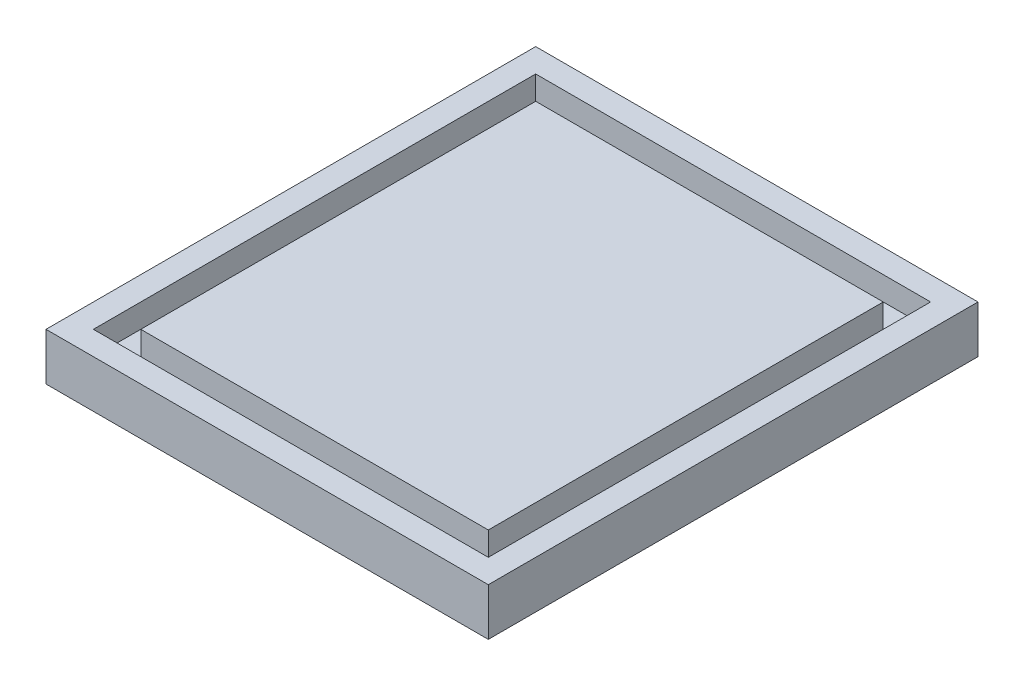
ISO-10303-21;
HEADER;
FILE_DESCRIPTION(('STEP AP214'),'2;1');
FILE_NAME('part.step','',(''),(''),'','','');
FILE_SCHEMA(('AUTOMOTIVE_DESIGN { 1 0 10303 214 1 1 1 1 }'));
ENDSEC;
DATA;
#1=APPLICATION_CONTEXT('core data for automotive mechanical design processes');
#2=APPLICATION_PROTOCOL_DEFINITION('international standard','automotive_design',2000,#1);
#3=PRODUCT_CONTEXT('',#1,'mechanical');
#4=PRODUCT('Part','Part','',(#3));
#5=PRODUCT_RELATED_PRODUCT_CATEGORY('part','',(#4));
#6=PRODUCT_DEFINITION_FORMATION('','',#4);
#7=PRODUCT_DEFINITION_CONTEXT('part definition',#1,'design');
#8=PRODUCT_DEFINITION('design','',#6,#7);
#9=PRODUCT_DEFINITION_SHAPE('','',#8);
#10=(LENGTH_UNIT() NAMED_UNIT(*) SI_UNIT(.MILLI.,.METRE.));
#11=(NAMED_UNIT(*) PLANE_ANGLE_UNIT() SI_UNIT($,.RADIAN.));
#12=(NAMED_UNIT(*) SI_UNIT($,.STERADIAN.) SOLID_ANGLE_UNIT());
#13=UNCERTAINTY_MEASURE_WITH_UNIT(LENGTH_MEASURE(1.E-05),#10,'distance_accuracy_value','');
#14=(GEOMETRIC_REPRESENTATION_CONTEXT(3) GLOBAL_UNCERTAINTY_ASSIGNED_CONTEXT((#13)) GLOBAL_UNIT_ASSIGNED_CONTEXT((#10,
#11,#12)) REPRESENTATION_CONTEXT('',''));
#15=CARTESIAN_POINT('',(0.,0.,0.));
#16=DIRECTION('',(0.,0.,1.));
#17=DIRECTION('',(1.,0.,0.));
#18=AXIS2_PLACEMENT_3D('',#15,#16,#17);
#19=CARTESIAN_POINT('',(0.,0.,0.));
#20=DIRECTION('',(0.,1.,0.));
#21=DIRECTION('',(0.,0.,1.));
#22=AXIS2_PLACEMENT_3D('',#19,#20,#21);
#23=PLANE('',#22);
#24=DIRECTION('',(0.,0.,1.));
#25=VECTOR('',#24,1.);
#26=CARTESIAN_POINT('',(-3.,0.,0.));
#27=LINE('',#26,#25);
#28=CARTESIAN_POINT('',(-3.,0.,-25.));
#29=VERTEX_POINT('',#28);
#30=CARTESIAN_POINT('',(-3.,0.,3.));
#31=VERTEX_POINT('',#30);
#32=EDGE_CURVE('E171',#29,#31,#27,.T.);
#33=ORIENTED_EDGE('',*,*,#32,.T.);
#34=DIRECTION('',(1.,0.,0.));
#35=VECTOR('',#34,1.);
#36=CARTESIAN_POINT('',(0.,0.,3.));
#37=LINE('',#36,#35);
#38=CARTESIAN_POINT('',(22.,0.,3.));
#39=VERTEX_POINT('',#38);
#40=EDGE_CURVE('E194',#31,#39,#37,.T.);
#41=ORIENTED_EDGE('',*,*,#40,.T.);
#42=DIRECTION('',(0.,0.,1.));
#43=VECTOR('',#42,1.);
#44=CARTESIAN_POINT('',(22.,0.,0.));
#45=LINE('',#44,#43);
#46=CARTESIAN_POINT('',(22.,0.,-25.));
#47=VERTEX_POINT('',#46);
#48=EDGE_CURVE('E217',#47,#39,#45,.T.);
#49=ORIENTED_EDGE('',*,*,#48,.F.);
#50=DIRECTION('',(1.,0.,0.));
#51=VECTOR('',#50,1.);
#52=CARTESIAN_POINT('',(0.,0.,-25.));
#53=LINE('',#52,#51);
#54=EDGE_CURVE('E84',#29,#47,#53,.T.);
#55=ORIENTED_EDGE('',*,*,#54,.F.);
#56=EDGE_LOOP('',(#33,#41,#49,#55));
#57=FACE_BOUND('',#56,.T.);
#58=DIRECTION('',(0.,0.,1.));
#59=VECTOR('',#58,1.);
#60=CARTESIAN_POINT('',(20.5,0.,0.));
#61=LINE('',#60,#59);
#62=CARTESIAN_POINT('',(20.5,0.,-23.5));
#63=VERTEX_POINT('',#62);
#64=CARTESIAN_POINT('',(20.5,0.,1.5));
#65=VERTEX_POINT('',#64);
#66=EDGE_CURVE('E182',#63,#65,#61,.T.);
#67=ORIENTED_EDGE('',*,*,#66,.T.);
#68=DIRECTION('',(1.,0.,0.));
#69=VECTOR('',#68,1.);
#70=CARTESIAN_POINT('',(0.,0.,1.5));
#71=LINE('',#70,#69);
#72=CARTESIAN_POINT('',(-1.5,0.,1.5));
#73=VERTEX_POINT('',#72);
#74=EDGE_CURVE('E167',#73,#65,#71,.T.);
#75=ORIENTED_EDGE('',*,*,#74,.F.);
#76=DIRECTION('',(0.,0.,1.));
#77=VECTOR('',#76,1.);
#78=CARTESIAN_POINT('',(-1.5,0.,0.));
#79=LINE('',#78,#77);
#80=CARTESIAN_POINT('',(-1.5,0.,-23.5));
#81=VERTEX_POINT('',#80);
#82=EDGE_CURVE('E161',#81,#73,#79,.T.);
#83=ORIENTED_EDGE('',*,*,#82,.F.);
#84=DIRECTION('',(1.,0.,0.));
#85=VECTOR('',#84,1.);
#86=CARTESIAN_POINT('',(0.,0.,-23.5));
#87=LINE('',#86,#85);
#88=EDGE_CURVE('E76',#81,#63,#87,.T.);
#89=ORIENTED_EDGE('',*,*,#88,.T.);
#90=EDGE_LOOP('',(#67,#75,#83,#89));
#91=FACE_BOUND('',#90,.T.);
#92=ADVANCED_FACE('F59',(#57,#91),#23,.T.);
#93=CARTESIAN_POINT('',(-4.5,-1.5,0.));
#94=DIRECTION('',(-1.,0.,0.));
#95=DIRECTION('',(0.,0.,1.));
#96=AXIS2_PLACEMENT_3D('',#93,#94,#95);
#97=PLANE('',#96);
#98=DIRECTION('',(0.,1.,0.));
#99=VECTOR('',#98,1.);
#100=CARTESIAN_POINT('',(-4.5,-1.5,4.50000000000001));
#101=LINE('',#100,#99);
#102=CARTESIAN_POINT('',(-4.5,-1.5,4.50000000000001));
#103=VERTEX_POINT('',#102);
#104=CARTESIAN_POINT('',(-4.5,1.5,4.50000000000001));
#105=VERTEX_POINT('',#104);
#106=EDGE_CURVE('E63',#103,#105,#101,.T.);
#107=ORIENTED_EDGE('',*,*,#106,.T.);
#108=DIRECTION('',(0.,0.,1.));
#109=VECTOR('',#108,1.);
#110=CARTESIAN_POINT('',(-4.5,1.5,0.));
#111=LINE('',#110,#109);
#112=CARTESIAN_POINT('',(-4.50000000000001,1.5,-26.5));
#113=VERTEX_POINT('',#112);
#114=EDGE_CURVE('E200',#113,#105,#111,.T.);
#115=ORIENTED_EDGE('',*,*,#114,.F.);
#116=DIRECTION('',(0.,1.,0.));
#117=VECTOR('',#116,1.);
#118=CARTESIAN_POINT('',(-4.50000000000001,-1.5,-26.5));
#119=LINE('',#118,#117);
#120=CARTESIAN_POINT('',(-4.50000000000001,-1.5,-26.5));
#121=VERTEX_POINT('',#120);
#122=EDGE_CURVE('E12',#121,#113,#119,.T.);
#123=ORIENTED_EDGE('',*,*,#122,.F.);
#124=DIRECTION('',(0.,0.,1.));
#125=VECTOR('',#124,1.);
#126=CARTESIAN_POINT('',(-4.5,-1.5,0.));
#127=LINE('',#126,#125);
#128=EDGE_CURVE('E231',#121,#103,#127,.T.);
#129=ORIENTED_EDGE('',*,*,#128,.T.);
#130=EDGE_LOOP('',(#107,#115,#123,#129));
#131=FACE_BOUND('',#130,.T.);
#132=ADVANCED_FACE('F61',(#131),#97,.T.);
#133=CARTESIAN_POINT('',(0.,-1.5,-26.5));
#134=DIRECTION('',(0.,0.,1.));
#135=DIRECTION('',(1.,0.,0.));
#136=AXIS2_PLACEMENT_3D('',#133,#134,#135);
#137=PLANE('',#136);
#138=ORIENTED_EDGE('',*,*,#122,.T.);
#139=DIRECTION('',(1.,0.,0.));
#140=VECTOR('',#139,1.);
#141=CARTESIAN_POINT('',(0.,1.5,-26.5));
#142=LINE('',#141,#140);
#143=CARTESIAN_POINT('',(23.5,1.5,-26.5));
#144=VERTEX_POINT('',#143);
#145=EDGE_CURVE('E197',#113,#144,#142,.T.);
#146=ORIENTED_EDGE('',*,*,#145,.T.);
#147=DIRECTION('',(0.,1.,0.));
#148=VECTOR('',#147,1.);
#149=CARTESIAN_POINT('',(23.5,-1.5,-26.5));
#150=LINE('',#149,#148);
#151=CARTESIAN_POINT('',(23.5,-1.5,-26.5));
#152=VERTEX_POINT('',#151);
#153=EDGE_CURVE('E68',#152,#144,#150,.T.);
#154=ORIENTED_EDGE('',*,*,#153,.F.);
#155=DIRECTION('',(1.,0.,0.));
#156=VECTOR('',#155,1.);
#157=CARTESIAN_POINT('',(0.,-1.5,-26.5));
#158=LINE('',#157,#156);
#159=EDGE_CURVE('E239',#121,#152,#158,.T.);
#160=ORIENTED_EDGE('',*,*,#159,.F.);
#161=EDGE_LOOP('',(#138,#146,#154,#160));
#162=FACE_BOUND('',#161,.T.);
#163=ADVANCED_FACE('F265',(#162),#137,.F.);
#164=CARTESIAN_POINT('',(23.5,-1.5,0.));
#165=DIRECTION('',(-1.,0.,0.));
#166=DIRECTION('',(0.,0.,1.));
#167=AXIS2_PLACEMENT_3D('',#164,#165,#166);
#168=PLANE('',#167);
#169=ORIENTED_EDGE('',*,*,#153,.T.);
#170=DIRECTION('',(0.,0.,1.));
#171=VECTOR('',#170,1.);
#172=CARTESIAN_POINT('',(23.5,1.5,0.));
#173=LINE('',#172,#171);
#174=CARTESIAN_POINT('',(23.5,1.5,4.5));
#175=VERTEX_POINT('',#174);
#176=EDGE_CURVE('E193',#144,#175,#173,.T.);
#177=ORIENTED_EDGE('',*,*,#176,.T.);
#178=DIRECTION('',(0.,1.,0.));
#179=VECTOR('',#178,1.);
#180=CARTESIAN_POINT('',(23.5,-1.5,4.5));
#181=LINE('',#180,#179);
#182=CARTESIAN_POINT('',(23.5,-1.5,4.5));
#183=VERTEX_POINT('',#182);
#184=EDGE_CURVE('E241',#183,#175,#181,.T.);
#185=ORIENTED_EDGE('',*,*,#184,.F.);
#186=DIRECTION('',(0.,0.,1.));
#187=VECTOR('',#186,1.);
#188=CARTESIAN_POINT('',(23.5,-1.5,0.));
#189=LINE('',#188,#187);
#190=EDGE_CURVE('E237',#152,#183,#189,.T.);
#191=ORIENTED_EDGE('',*,*,#190,.F.);
#192=EDGE_LOOP('',(#169,#177,#185,#191));
#193=FACE_BOUND('',#192,.T.);
#194=ADVANCED_FACE('F257',(#193),#168,.F.);
#195=CARTESIAN_POINT('',(0.,-1.5,4.50000000000001));
#196=DIRECTION('',(0.,0.,1.));
#197=DIRECTION('',(1.,0.,0.));
#198=AXIS2_PLACEMENT_3D('',#195,#196,#197);
#199=PLANE('',#198);
#200=ORIENTED_EDGE('',*,*,#184,.T.);
#201=DIRECTION('',(1.,0.,0.));
#202=VECTOR('',#201,1.);
#203=CARTESIAN_POINT('',(0.,1.5,4.50000000000001));
#204=LINE('',#203,#202);
#205=EDGE_CURVE('E190',#105,#175,#204,.T.);
#206=ORIENTED_EDGE('',*,*,#205,.F.);
#207=ORIENTED_EDGE('',*,*,#106,.F.);
#208=DIRECTION('',(1.,0.,0.));
#209=VECTOR('',#208,1.);
#210=CARTESIAN_POINT('',(0.,-1.5,4.50000000000001));
#211=LINE('',#210,#209);
#212=EDGE_CURVE('E234',#103,#183,#211,.T.);
#213=ORIENTED_EDGE('',*,*,#212,.T.);
#214=EDGE_LOOP('',(#200,#206,#207,#213));
#215=FACE_BOUND('',#214,.T.);
#216=ADVANCED_FACE('F254',(#215),#199,.T.);
#217=CARTESIAN_POINT('',(0.,-1.5,0.));
#218=DIRECTION('',(0.,1.,0.));
#219=DIRECTION('',(0.,0.,1.));
#220=AXIS2_PLACEMENT_3D('',#217,#218,#219);
#221=PLANE('',#220);
#222=ORIENTED_EDGE('',*,*,#128,.F.);
#223=ORIENTED_EDGE('',*,*,#159,.T.);
#224=ORIENTED_EDGE('',*,*,#190,.T.);
#225=ORIENTED_EDGE('',*,*,#212,.F.);
#226=EDGE_LOOP('',(#222,#223,#224,#225));
#227=FACE_BOUND('',#226,.T.);
#228=ADVANCED_FACE('F256',(#227),#221,.F.);
#229=CARTESIAN_POINT('',(-3.,1.5,0.));
#230=DIRECTION('',(1.,0.,0.));
#231=DIRECTION('',(0.,0.,-1.));
#232=AXIS2_PLACEMENT_3D('',#229,#230,#231);
#233=PLANE('',#232);
#234=ORIENTED_EDGE('',*,*,#32,.F.);
#235=DIRECTION('',(0.,-1.,0.));
#236=VECTOR('',#235,1.);
#237=CARTESIAN_POINT('',(-3.,1.5,-25.));
#238=LINE('',#237,#236);
#239=CARTESIAN_POINT('',(-3.,1.5,-25.));
#240=VERTEX_POINT('',#239);
#241=EDGE_CURVE('E229',#240,#29,#238,.T.);
#242=ORIENTED_EDGE('',*,*,#241,.F.);
#243=DIRECTION('',(0.,0.,1.));
#244=VECTOR('',#243,1.);
#245=CARTESIAN_POINT('',(-3.,1.5,0.));
#246=LINE('',#245,#244);
#247=CARTESIAN_POINT('',(-3.,1.5,3.));
#248=VERTEX_POINT('',#247);
#249=EDGE_CURVE('E203',#240,#248,#246,.T.);
#250=ORIENTED_EDGE('',*,*,#249,.T.);
#251=DIRECTION('',(0.,-1.,0.));
#252=VECTOR('',#251,1.);
#253=CARTESIAN_POINT('',(-3.,1.5,3.));
#254=LINE('',#253,#252);
#255=EDGE_CURVE('E214',#248,#31,#254,.T.);
#256=ORIENTED_EDGE('',*,*,#255,.T.);
#257=EDGE_LOOP('',(#234,#242,#250,#256));
#258=FACE_BOUND('',#257,.T.);
#259=ADVANCED_FACE('F262',(#258),#233,.T.);
#260=CARTESIAN_POINT('',(0.,1.5,-25.));
#261=DIRECTION('',(0.,0.,-1.));
#262=DIRECTION('',(-1.,0.,0.));
#263=AXIS2_PLACEMENT_3D('',#260,#261,#262);
#264=PLANE('',#263);
#265=ORIENTED_EDGE('',*,*,#54,.T.);
#266=DIRECTION('',(0.,-1.,0.));
#267=VECTOR('',#266,1.);
#268=CARTESIAN_POINT('',(22.,1.5,-25.));
#269=LINE('',#268,#267);
#270=CARTESIAN_POINT('',(22.,1.5,-25.));
#271=VERTEX_POINT('',#270);
#272=EDGE_CURVE('E226',#271,#47,#269,.T.);
#273=ORIENTED_EDGE('',*,*,#272,.F.);
#274=DIRECTION('',(1.,0.,0.));
#275=VECTOR('',#274,1.);
#276=CARTESIAN_POINT('',(0.,1.5,-25.));
#277=LINE('',#276,#275);
#278=EDGE_CURVE('E206',#240,#271,#277,.T.);
#279=ORIENTED_EDGE('',*,*,#278,.F.);
#280=ORIENTED_EDGE('',*,*,#241,.T.);
#281=EDGE_LOOP('',(#265,#273,#279,#280));
#282=FACE_BOUND('',#281,.T.);
#283=ADVANCED_FACE('F305',(#282),#264,.F.);
#284=CARTESIAN_POINT('',(22.,1.5,0.));
#285=DIRECTION('',(1.,0.,0.));
#286=DIRECTION('',(0.,0.,-1.));
#287=AXIS2_PLACEMENT_3D('',#284,#285,#286);
#288=PLANE('',#287);
#289=ORIENTED_EDGE('',*,*,#48,.T.);
#290=DIRECTION('',(0.,-1.,0.));
#291=VECTOR('',#290,1.);
#292=CARTESIAN_POINT('',(22.,1.5,3.));
#293=LINE('',#292,#291);
#294=CARTESIAN_POINT('',(22.,1.5,3.));
#295=VERTEX_POINT('',#294);
#296=EDGE_CURVE('E223',#295,#39,#293,.T.);
#297=ORIENTED_EDGE('',*,*,#296,.F.);
#298=DIRECTION('',(0.,0.,1.));
#299=VECTOR('',#298,1.);
#300=CARTESIAN_POINT('',(22.,1.5,0.));
#301=LINE('',#300,#299);
#302=EDGE_CURVE('E209',#271,#295,#301,.T.);
#303=ORIENTED_EDGE('',*,*,#302,.F.);
#304=ORIENTED_EDGE('',*,*,#272,.T.);
#305=EDGE_LOOP('',(#289,#297,#303,#304));
#306=FACE_BOUND('',#305,.T.);
#307=ADVANCED_FACE('F314',(#306),#288,.F.);
#308=CARTESIAN_POINT('',(0.,1.5,3.));
#309=DIRECTION('',(0.,0.,-1.));
#310=DIRECTION('',(-1.,0.,0.));
#311=AXIS2_PLACEMENT_3D('',#308,#309,#310);
#312=PLANE('',#311);
#313=ORIENTED_EDGE('',*,*,#40,.F.);
#314=ORIENTED_EDGE('',*,*,#255,.F.);
#315=DIRECTION('',(1.,0.,0.));
#316=VECTOR('',#315,1.);
#317=CARTESIAN_POINT('',(0.,1.5,3.));
#318=LINE('',#317,#316);
#319=EDGE_CURVE('E211',#248,#295,#318,.T.);
#320=ORIENTED_EDGE('',*,*,#319,.T.);
#321=ORIENTED_EDGE('',*,*,#296,.T.);
#322=EDGE_LOOP('',(#313,#314,#320,#321));
#323=FACE_BOUND('',#322,.T.);
#324=ADVANCED_FACE('F324',(#323),#312,.T.);
#325=CARTESIAN_POINT('',(0.,1.5,0.));
#326=DIRECTION('',(0.,1.,0.));
#327=DIRECTION('',(0.,0.,1.));
#328=AXIS2_PLACEMENT_3D('',#325,#326,#327);
#329=PLANE('',#328);
#330=ORIENTED_EDGE('',*,*,#205,.T.);
#331=ORIENTED_EDGE('',*,*,#176,.F.);
#332=ORIENTED_EDGE('',*,*,#145,.F.);
#333=ORIENTED_EDGE('',*,*,#114,.T.);
#334=EDGE_LOOP('',(#330,#331,#332,#333));
#335=FACE_BOUND('',#334,.T.);
#336=ORIENTED_EDGE('',*,*,#249,.F.);
#337=ORIENTED_EDGE('',*,*,#278,.T.);
#338=ORIENTED_EDGE('',*,*,#302,.T.);
#339=ORIENTED_EDGE('',*,*,#319,.F.);
#340=EDGE_LOOP('',(#336,#337,#338,#339));
#341=FACE_BOUND('',#340,.T.);
#342=ADVANCED_FACE('F251',(#335,#341),#329,.T.);
#343=CARTESIAN_POINT('',(0.,1.5,1.5));
#344=DIRECTION('',(0.,0.,-1.));
#345=DIRECTION('',(-1.,0.,0.));
#346=AXIS2_PLACEMENT_3D('',#343,#344,#345);
#347=PLANE('',#346);
#348=ORIENTED_EDGE('',*,*,#74,.T.);
#349=DIRECTION('',(0.,-1.,0.));
#350=VECTOR('',#349,1.);
#351=CARTESIAN_POINT('',(20.5,1.5,1.5));
#352=LINE('',#351,#350);
#353=CARTESIAN_POINT('',(20.5,1.5,1.5));
#354=VERTEX_POINT('',#353);
#355=EDGE_CURVE('E164',#354,#65,#352,.T.);
#356=ORIENTED_EDGE('',*,*,#355,.F.);
#357=DIRECTION('',(1.,0.,0.));
#358=VECTOR('',#357,1.);
#359=CARTESIAN_POINT('',(0.,1.5,1.5));
#360=LINE('',#359,#358);
#361=CARTESIAN_POINT('',(-1.5,1.5,1.5));
#362=VERTEX_POINT('',#361);
#363=EDGE_CURVE('E149',#362,#354,#360,.T.);
#364=ORIENTED_EDGE('',*,*,#363,.F.);
#365=DIRECTION('',(0.,-1.,0.));
#366=VECTOR('',#365,1.);
#367=CARTESIAN_POINT('',(-1.5,1.5,1.5));
#368=LINE('',#367,#366);
#369=EDGE_CURVE('E180',#362,#73,#368,.T.);
#370=ORIENTED_EDGE('',*,*,#369,.T.);
#371=EDGE_LOOP('',(#348,#356,#364,#370));
#372=FACE_BOUND('',#371,.T.);
#373=ADVANCED_FACE('F165',(#372),#347,.F.);
#374=CARTESIAN_POINT('',(20.5,1.5,0.));
#375=DIRECTION('',(1.,0.,0.));
#376=DIRECTION('',(0.,0.,-1.));
#377=AXIS2_PLACEMENT_3D('',#374,#375,#376);
#378=PLANE('',#377);
#379=ORIENTED_EDGE('',*,*,#66,.F.);
#380=DIRECTION('',(0.,-1.,0.));
#381=VECTOR('',#380,1.);
#382=CARTESIAN_POINT('',(20.5,1.5,-23.5));
#383=LINE('',#382,#381);
#384=CARTESIAN_POINT('',(20.5,1.5,-23.5));
#385=VERTEX_POINT('',#384);
#386=EDGE_CURVE('E172',#385,#63,#383,.T.);
#387=ORIENTED_EDGE('',*,*,#386,.F.);
#388=DIRECTION('',(0.,0.,1.));
#389=VECTOR('',#388,1.);
#390=CARTESIAN_POINT('',(20.5,1.5,0.));
#391=LINE('',#390,#389);
#392=EDGE_CURVE('E154',#385,#354,#391,.T.);
#393=ORIENTED_EDGE('',*,*,#392,.T.);
#394=ORIENTED_EDGE('',*,*,#355,.T.);
#395=EDGE_LOOP('',(#379,#387,#393,#394));
#396=FACE_BOUND('',#395,.T.);
#397=ADVANCED_FACE('F174',(#396),#378,.T.);
#398=CARTESIAN_POINT('',(0.,1.5,-23.5));
#399=DIRECTION('',(0.,0.,-1.));
#400=DIRECTION('',(-1.,0.,0.));
#401=AXIS2_PLACEMENT_3D('',#398,#399,#400);
#402=PLANE('',#401);
#403=ORIENTED_EDGE('',*,*,#88,.F.);
#404=DIRECTION('',(0.,-1.,0.));
#405=VECTOR('',#404,1.);
#406=CARTESIAN_POINT('',(-1.5,1.5,-23.5));
#407=LINE('',#406,#405);
#408=CARTESIAN_POINT('',(-1.5,1.5,-23.5));
#409=VERTEX_POINT('',#408);
#410=EDGE_CURVE('E187',#409,#81,#407,.T.);
#411=ORIENTED_EDGE('',*,*,#410,.F.);
#412=DIRECTION('',(1.,0.,0.));
#413=VECTOR('',#412,1.);
#414=CARTESIAN_POINT('',(0.,1.5,-23.5));
#415=LINE('',#414,#413);
#416=EDGE_CURVE('E175',#409,#385,#415,.T.);
#417=ORIENTED_EDGE('',*,*,#416,.T.);
#418=ORIENTED_EDGE('',*,*,#386,.T.);
#419=EDGE_LOOP('',(#403,#411,#417,#418));
#420=FACE_BOUND('',#419,.T.);
#421=ADVANCED_FACE('F361',(#420),#402,.T.);
#422=CARTESIAN_POINT('',(-1.5,1.5,0.));
#423=DIRECTION('',(1.,0.,0.));
#424=DIRECTION('',(0.,0.,-1.));
#425=AXIS2_PLACEMENT_3D('',#422,#423,#424);
#426=PLANE('',#425);
#427=ORIENTED_EDGE('',*,*,#82,.T.);
#428=ORIENTED_EDGE('',*,*,#369,.F.);
#429=DIRECTION('',(0.,0.,1.));
#430=VECTOR('',#429,1.);
#431=CARTESIAN_POINT('',(-1.5,1.5,0.));
#432=LINE('',#431,#430);
#433=EDGE_CURVE('E157',#409,#362,#432,.T.);
#434=ORIENTED_EDGE('',*,*,#433,.F.);
#435=ORIENTED_EDGE('',*,*,#410,.T.);
#436=EDGE_LOOP('',(#427,#428,#434,#435));
#437=FACE_BOUND('',#436,.T.);
#438=ADVANCED_FACE('F370',(#437),#426,.F.);
#439=CARTESIAN_POINT('',(0.,1.5,0.));
#440=DIRECTION('',(0.,1.,0.));
#441=DIRECTION('',(0.,0.,1.));
#442=AXIS2_PLACEMENT_3D('',#439,#440,#441);
#443=PLANE('',#442);
#444=ORIENTED_EDGE('',*,*,#363,.T.);
#445=ORIENTED_EDGE('',*,*,#392,.F.);
#446=ORIENTED_EDGE('',*,*,#416,.F.);
#447=ORIENTED_EDGE('',*,*,#433,.T.);
#448=EDGE_LOOP('',(#444,#445,#446,#447));
#449=FACE_BOUND('',#448,.T.);
#450=ADVANCED_FACE('F151',(#449),#443,.T.);
#451=CLOSED_SHELL('',(#92,#132,#163,#194,#216,#228,#259,#283,#307,#324,#342,#373,#397,#421,#438,#450));
#452=MANIFOLD_SOLID_BREP('B2',#451);
#453=ADVANCED_BREP_SHAPE_REPRESENTATION('',(#18,#452),#14);
#454=SHAPE_DEFINITION_REPRESENTATION(#9,#453);
ENDSEC;
END-ISO-10303-21;
